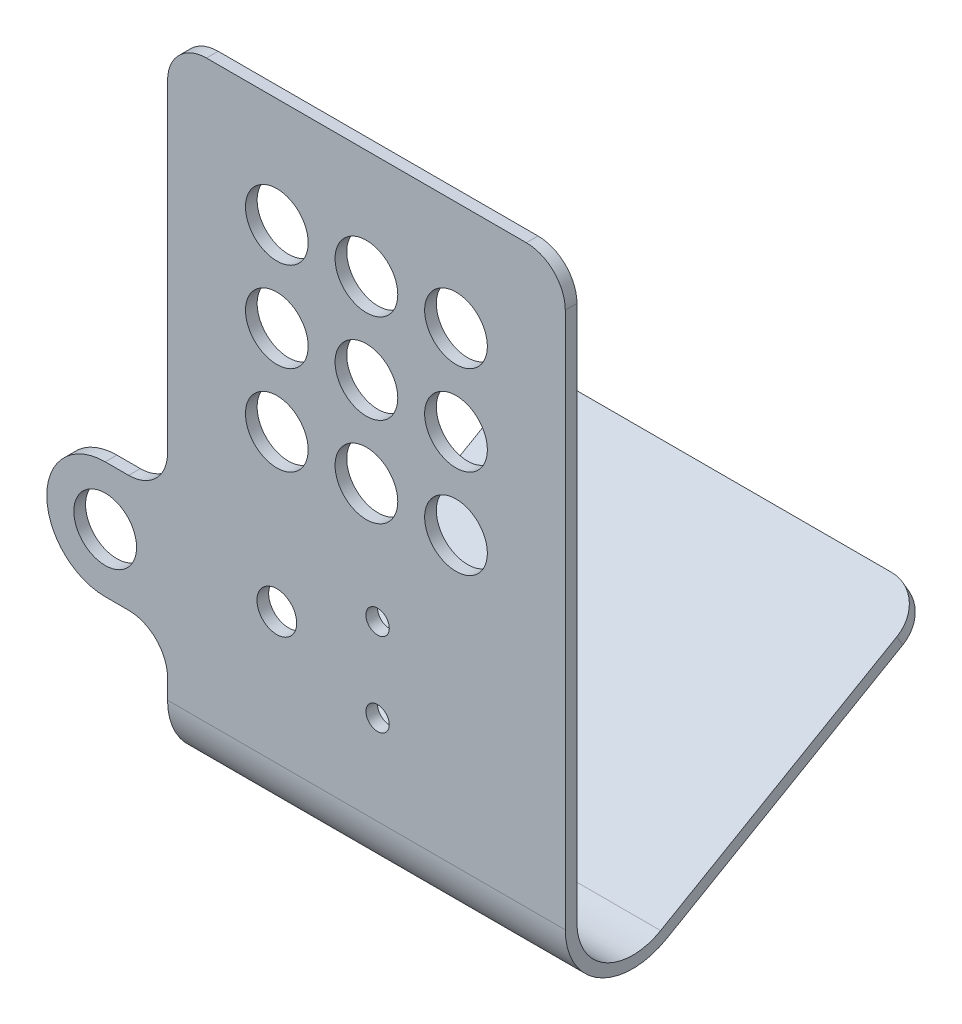
ISO-10303-21;
HEADER;
FILE_DESCRIPTION(('STEP AP214'),'2;1');
FILE_NAME('part.step','',(''),(''),'','','');
FILE_SCHEMA(('AUTOMOTIVE_DESIGN { 1 0 10303 214 1 1 1 1 }'));
ENDSEC;
DATA;
#1=APPLICATION_CONTEXT('core data for automotive mechanical design processes');
#2=APPLICATION_PROTOCOL_DEFINITION('international standard','automotive_design',2000,#1);
#3=PRODUCT_CONTEXT('',#1,'mechanical');
#4=PRODUCT('Part','Part','',(#3));
#5=PRODUCT_RELATED_PRODUCT_CATEGORY('part','',(#4));
#6=PRODUCT_DEFINITION_FORMATION('','',#4);
#7=PRODUCT_DEFINITION_CONTEXT('part definition',#1,'design');
#8=PRODUCT_DEFINITION('design','',#6,#7);
#9=PRODUCT_DEFINITION_SHAPE('','',#8);
#10=(LENGTH_UNIT() NAMED_UNIT(*) SI_UNIT(.MILLI.,.METRE.));
#11=(NAMED_UNIT(*) PLANE_ANGLE_UNIT() SI_UNIT($,.RADIAN.));
#12=(NAMED_UNIT(*) SI_UNIT($,.STERADIAN.) SOLID_ANGLE_UNIT());
#13=UNCERTAINTY_MEASURE_WITH_UNIT(LENGTH_MEASURE(1.E-05),#10,'distance_accuracy_value','');
#14=(GEOMETRIC_REPRESENTATION_CONTEXT(3) GLOBAL_UNCERTAINTY_ASSIGNED_CONTEXT((#13)) GLOBAL_UNIT_ASSIGNED_CONTEXT((#10,
#11,#12)) REPRESENTATION_CONTEXT('',''));
#15=CARTESIAN_POINT('',(0.,0.,0.));
#16=DIRECTION('',(0.,0.,1.));
#17=DIRECTION('',(1.,0.,0.));
#18=AXIS2_PLACEMENT_3D('',#15,#16,#17);
#19=CARTESIAN_POINT('',(-51.05,0.,-3.));
#20=DIRECTION('',(-1.,0.,0.));
#21=DIRECTION('',(0.,-1.,0.));
#22=AXIS2_PLACEMENT_3D('',#19,#20,#21);
#23=PLANE('',#22);
#24=DIRECTION('',(0.,-1.,0.));
#25=VECTOR('',#24,1.);
#26=CARTESIAN_POINT('',(-51.05,0.,0.));
#27=LINE('',#26,#25);
#28=CARTESIAN_POINT('',(-51.05,-91.7151361062223,0.));
#29=VERTEX_POINT('',#28);
#30=CARTESIAN_POINT('',(-51.05,-96.7151361062223,0.));
#31=VERTEX_POINT('',#30);
#32=EDGE_CURVE('E311',#29,#31,#27,.T.);
#33=ORIENTED_EDGE('',*,*,#32,.F.);
#34=DIRECTION('',(0.,0.,-1.));
#35=VECTOR('',#34,1.);
#36=CARTESIAN_POINT('',(-51.05,-91.7151361062223,-3.));
#37=LINE('',#36,#35);
#38=CARTESIAN_POINT('',(-51.05,-91.7151361062223,-3.));
#39=VERTEX_POINT('',#38);
#40=EDGE_CURVE('E353',#29,#39,#37,.T.);
#41=ORIENTED_EDGE('',*,*,#40,.T.);
#42=DIRECTION('',(0.,-1.,0.));
#43=VECTOR('',#42,1.);
#44=CARTESIAN_POINT('',(-51.05,0.,-3.));
#45=LINE('',#44,#43);
#46=CARTESIAN_POINT('',(-51.05,-96.7151361062223,-3.));
#47=VERTEX_POINT('',#46);
#48=EDGE_CURVE('E265',#39,#47,#45,.T.);
#49=ORIENTED_EDGE('',*,*,#48,.T.);
#50=CARTESIAN_POINT('',(-51.05,-96.7151361062223,-17.3205080756887));
#51=DIRECTION('',(1.,0.,0.));
#52=DIRECTION('',(0.,1.,0.));
#53=AXIS2_PLACEMENT_3D('',#50,#51,#52);
#54=CIRCLE('',#53,14.3205080756887);
#55=CARTESIAN_POINT('',(-51.05,-109.117059894869,-24.4807621135331));
#56=VERTEX_POINT('',#55);
#57=EDGE_CURVE('E202',#47,#56,#54,.T.);
#58=ORIENTED_EDGE('',*,*,#57,.T.);
#59=DIRECTION('',(0.,0.500000000000004,-0.866025403784436));
#60=VECTOR('',#59,1.);
#61=CARTESIAN_POINT('',(-51.05,-109.117059894869,-24.4807621135331));
#62=LINE('',#61,#60);
#63=CARTESIAN_POINT('',(-51.05,-74.1170598948686,-85.1025403784436));
#64=VERTEX_POINT('',#63);
#65=EDGE_CURVE('E205',#56,#64,#62,.T.);
#66=ORIENTED_EDGE('',*,*,#65,.T.);
#67=DIRECTION('',(0.,-0.866025403784435,-0.500000000000006));
#68=VECTOR('',#67,1.);
#69=CARTESIAN_POINT('',(-51.05,17.0221778677676,-32.4832769224475));
#70=LINE('',#69,#68);
#71=CARTESIAN_POINT('',(-51.05,-76.7151361062219,-86.6025403784436));
#72=VERTEX_POINT('',#71);
#73=EDGE_CURVE('E337',#64,#72,#70,.T.);
#74=ORIENTED_EDGE('',*,*,#73,.T.);
#75=DIRECTION('',(0.,-0.500000000000004,0.866025403784436));
#76=VECTOR('',#75,1.);
#77=CARTESIAN_POINT('',(-51.05,-71.7151361062219,-95.262794416288));
#78=LINE('',#77,#76);
#79=CARTESIAN_POINT('',(-51.05,-111.715136106222,-25.9807621135331));
#80=VERTEX_POINT('',#79);
#81=EDGE_CURVE('E208',#72,#80,#78,.T.);
#82=ORIENTED_EDGE('',*,*,#81,.T.);
#83=CARTESIAN_POINT('',(-51.05,-96.7151361062223,-17.3205080756887));
#84=DIRECTION('',(-1.,0.,0.));
#85=DIRECTION('',(0.,1.,0.));
#86=AXIS2_PLACEMENT_3D('',#83,#84,#85);
#87=CIRCLE('',#86,17.3205080756887);
#88=EDGE_CURVE('E210',#80,#31,#87,.T.);
#89=ORIENTED_EDGE('',*,*,#88,.T.);
#90=EDGE_LOOP('',(#33,#41,#49,#58,#66,#74,#82,#89));
#91=FACE_BOUND('',#90,.T.);
#92=ADVANCED_FACE('F34',(#91),#23,.T.);
#93=CARTESIAN_POINT('',(0.,51.05,-3.));
#94=DIRECTION('',(0.,1.,0.));
#95=DIRECTION('',(0.,0.,1.));
#96=AXIS2_PLACEMENT_3D('',#93,#94,#95);
#97=PLANE('',#96);
#98=DIRECTION('',(-1.,0.,0.));
#99=VECTOR('',#98,1.);
#100=CARTESIAN_POINT('',(0.,51.05,-3.));
#101=LINE('',#100,#99);
#102=CARTESIAN_POINT('',(41.05,51.05,-3.));
#103=VERTEX_POINT('',#102);
#104=CARTESIAN_POINT('',(-41.05,51.05,-3.));
#105=VERTEX_POINT('',#104);
#106=EDGE_CURVE('E262',#103,#105,#101,.T.);
#107=ORIENTED_EDGE('',*,*,#106,.T.);
#108=DIRECTION('',(0.,0.,1.));
#109=VECTOR('',#108,1.);
#110=CARTESIAN_POINT('',(-41.05,51.05,-3.));
#111=LINE('',#110,#109);
#112=CARTESIAN_POINT('',(-41.05,51.05,0.));
#113=VERTEX_POINT('',#112);
#114=EDGE_CURVE('E342',#105,#113,#111,.T.);
#115=ORIENTED_EDGE('',*,*,#114,.T.);
#116=DIRECTION('',(-1.,0.,0.));
#117=VECTOR('',#116,1.);
#118=CARTESIAN_POINT('',(0.,51.05,0.));
#119=LINE('',#118,#117);
#120=CARTESIAN_POINT('',(41.05,51.05,0.));
#121=VERTEX_POINT('',#120);
#122=EDGE_CURVE('E309',#121,#113,#119,.T.);
#123=ORIENTED_EDGE('',*,*,#122,.F.);
#124=DIRECTION('',(0.,0.,1.));
#125=VECTOR('',#124,1.);
#126=CARTESIAN_POINT('',(41.05,51.05,-3.));
#127=LINE('',#126,#125);
#128=EDGE_CURVE('E340',#121,#103,#127,.F.);
#129=ORIENTED_EDGE('',*,*,#128,.T.);
#130=EDGE_LOOP('',(#107,#115,#123,#129));
#131=FACE_BOUND('',#130,.T.);
#132=ADVANCED_FACE('F407',(#131),#97,.T.);
#133=CARTESIAN_POINT('',(51.05,0.,-3.));
#134=DIRECTION('',(-1.,0.,0.));
#135=DIRECTION('',(0.,-1.,0.));
#136=AXIS2_PLACEMENT_3D('',#133,#134,#135);
#137=PLANE('',#136);
#138=DIRECTION('',(0.,0.500000000000004,-0.866025403784436));
#139=VECTOR('',#138,1.);
#140=CARTESIAN_POINT('',(51.05,-71.7151361062219,-95.262794416288));
#141=LINE('',#140,#139);
#142=CARTESIAN_POINT('',(51.05,-111.715136106222,-25.9807621135331));
#143=VERTEX_POINT('',#142);
#144=CARTESIAN_POINT('',(51.05,-76.7151361062219,-86.6025403784436));
#145=VERTEX_POINT('',#144);
#146=EDGE_CURVE('E192',#143,#145,#141,.T.);
#147=ORIENTED_EDGE('',*,*,#146,.T.);
#148=DIRECTION('',(0.,0.866025403784435,0.500000000000006));
#149=VECTOR('',#148,1.);
#150=CARTESIAN_POINT('',(51.05,-74.1170598948687,-85.1025403784436));
#151=LINE('',#150,#149);
#152=CARTESIAN_POINT('',(51.05,-74.1170598948686,-85.1025403784436));
#153=VERTEX_POINT('',#152);
#154=EDGE_CURVE('E320',#145,#153,#151,.T.);
#155=ORIENTED_EDGE('',*,*,#154,.T.);
#156=DIRECTION('',(0.,-0.500000000000004,0.866025403784436));
#157=VECTOR('',#156,1.);
#158=CARTESIAN_POINT('',(51.05,-109.117059894869,-24.4807621135331));
#159=LINE('',#158,#157);
#160=CARTESIAN_POINT('',(51.05,-109.117059894869,-24.4807621135331));
#161=VERTEX_POINT('',#160);
#162=EDGE_CURVE('E201',#153,#161,#159,.T.);
#163=ORIENTED_EDGE('',*,*,#162,.T.);
#164=CARTESIAN_POINT('',(51.05,-96.7151361062223,-17.3205080756887));
#165=DIRECTION('',(-1.,0.,0.));
#166=DIRECTION('',(0.,-1.,0.));
#167=AXIS2_PLACEMENT_3D('',#164,#165,#166);
#168=CIRCLE('',#167,14.3205080756887);
#169=CARTESIAN_POINT('',(51.05,-96.7151361062223,-3.));
#170=VERTEX_POINT('',#169);
#171=EDGE_CURVE('E198',#161,#170,#168,.T.);
#172=ORIENTED_EDGE('',*,*,#171,.T.);
#173=DIRECTION('',(0.,-1.,0.));
#174=VECTOR('',#173,1.);
#175=CARTESIAN_POINT('',(51.05,0.,-3.));
#176=LINE('',#175,#174);
#177=CARTESIAN_POINT('',(51.05,41.05,-3.));
#178=VERTEX_POINT('',#177);
#179=EDGE_CURVE('E271',#178,#170,#176,.T.);
#180=ORIENTED_EDGE('',*,*,#179,.F.);
#181=DIRECTION('',(0.,0.,1.));
#182=VECTOR('',#181,1.);
#183=CARTESIAN_POINT('',(51.05,41.05,0.));
#184=LINE('',#183,#182);
#185=CARTESIAN_POINT('',(51.05,41.05,0.));
#186=VERTEX_POINT('',#185);
#187=EDGE_CURVE('E273',#178,#186,#184,.T.);
#188=ORIENTED_EDGE('',*,*,#187,.T.);
#189=DIRECTION('',(0.,-1.,0.));
#190=VECTOR('',#189,1.);
#191=CARTESIAN_POINT('',(51.05,0.,0.));
#192=LINE('',#191,#190);
#193=CARTESIAN_POINT('',(51.05,-96.7151361062223,0.));
#194=VERTEX_POINT('',#193);
#195=EDGE_CURVE('E229',#186,#194,#192,.T.);
#196=ORIENTED_EDGE('',*,*,#195,.T.);
#197=CARTESIAN_POINT('',(51.05,-96.7151361062223,-17.3205080756887));
#198=DIRECTION('',(-1.,0.,0.));
#199=DIRECTION('',(0.,-1.,0.));
#200=AXIS2_PLACEMENT_3D('',#197,#198,#199);
#201=CIRCLE('',#200,17.3205080756887);
#202=EDGE_CURVE('E195',#194,#143,#201,.F.);
#203=ORIENTED_EDGE('',*,*,#202,.T.);
#204=EDGE_LOOP('',(#147,#155,#163,#172,#180,#188,#196,#203));
#205=FACE_BOUND('',#204,.T.);
#206=ADVANCED_FACE('F411',(#205),#137,.F.);
#207=CARTESIAN_POINT('',(-23.,23.,-3.));
#208=DIRECTION('',(0.,0.,1.));
#209=DIRECTION('',(1.,0.,0.));
#210=AXIS2_PLACEMENT_3D('',#207,#208,#209);
#211=CYLINDRICAL_SURFACE('',#210,8.05000000000001);
#212=CARTESIAN_POINT('',(-23.,23.,-3.));
#213=DIRECTION('',(0.,0.,1.));
#214=DIRECTION('',(1.,0.,0.));
#215=AXIS2_PLACEMENT_3D('',#212,#213,#214);
#216=CIRCLE('',#215,8.05000000000001);
#217=CARTESIAN_POINT('',(-14.95,23.,-3.));
#218=VERTEX_POINT('',#217);
#219=EDGE_CURVE('E259',#218,#218,#216,.T.);
#220=ORIENTED_EDGE('',*,*,#219,.F.);
#221=EDGE_LOOP('',(#220));
#222=FACE_BOUND('',#221,.T.);
#223=CARTESIAN_POINT('',(-23.,23.,0.));
#224=DIRECTION('',(0.,0.,1.));
#225=DIRECTION('',(1.,0.,0.));
#226=AXIS2_PLACEMENT_3D('',#223,#224,#225);
#227=CIRCLE('',#226,8.05000000000001);
#228=CARTESIAN_POINT('',(-14.95,23.,0.));
#229=VERTEX_POINT('',#228);
#230=EDGE_CURVE('E306',#229,#229,#227,.T.);
#231=ORIENTED_EDGE('',*,*,#230,.T.);
#232=EDGE_LOOP('',(#231));
#233=FACE_BOUND('',#232,.T.);
#234=ADVANCED_FACE('F416',(#222,#233),#211,.F.);
#235=CARTESIAN_POINT('',(0.,23.,-3.));
#236=DIRECTION('',(0.,0.,1.));
#237=DIRECTION('',(1.,0.,0.));
#238=AXIS2_PLACEMENT_3D('',#235,#236,#237);
#239=CYLINDRICAL_SURFACE('',#238,8.05);
#240=CARTESIAN_POINT('',(0.,23.,-3.));
#241=DIRECTION('',(0.,0.,1.));
#242=DIRECTION('',(1.,0.,0.));
#243=AXIS2_PLACEMENT_3D('',#240,#241,#242);
#244=CIRCLE('',#243,8.05);
#245=CARTESIAN_POINT('',(8.05,23.,-3.));
#246=VERTEX_POINT('',#245);
#247=EDGE_CURVE('E256',#246,#246,#244,.T.);
#248=ORIENTED_EDGE('',*,*,#247,.F.);
#249=EDGE_LOOP('',(#248));
#250=FACE_BOUND('',#249,.T.);
#251=CARTESIAN_POINT('',(0.,23.,0.));
#252=DIRECTION('',(0.,0.,1.));
#253=DIRECTION('',(1.,0.,0.));
#254=AXIS2_PLACEMENT_3D('',#251,#252,#253);
#255=CIRCLE('',#254,8.05);
#256=CARTESIAN_POINT('',(8.05,23.,0.));
#257=VERTEX_POINT('',#256);
#258=EDGE_CURVE('E303',#257,#257,#255,.T.);
#259=ORIENTED_EDGE('',*,*,#258,.T.);
#260=EDGE_LOOP('',(#259));
#261=FACE_BOUND('',#260,.T.);
#262=ADVANCED_FACE('F419',(#250,#261),#239,.F.);
#263=CARTESIAN_POINT('',(2.86862691031601,-52.2848638937774,-3.));
#264=DIRECTION('',(0.,0.,1.));
#265=DIRECTION('',(1.,0.,0.));
#266=AXIS2_PLACEMENT_3D('',#263,#264,#265);
#267=CYLINDRICAL_SURFACE('',#266,3.);
#268=CARTESIAN_POINT('',(2.86862691031601,-52.2848638937774,-3.));
#269=DIRECTION('',(0.,0.,1.));
#270=DIRECTION('',(1.,0.,0.));
#271=AXIS2_PLACEMENT_3D('',#268,#269,#270);
#272=CIRCLE('',#271,3.);
#273=CARTESIAN_POINT('',(5.86862691031601,-52.2848638937774,-3.));
#274=VERTEX_POINT('',#273);
#275=EDGE_CURVE('E253',#274,#274,#272,.T.);
#276=ORIENTED_EDGE('',*,*,#275,.F.);
#277=EDGE_LOOP('',(#276));
#278=FACE_BOUND('',#277,.T.);
#279=CARTESIAN_POINT('',(2.86862691031601,-52.2848638937774,0.));
#280=DIRECTION('',(0.,0.,1.));
#281=DIRECTION('',(1.,0.,0.));
#282=AXIS2_PLACEMENT_3D('',#279,#280,#281);
#283=CIRCLE('',#282,3.);
#284=CARTESIAN_POINT('',(5.86862691031601,-52.2848638937774,0.));
#285=VERTEX_POINT('',#284);
#286=EDGE_CURVE('E300',#285,#285,#283,.T.);
#287=ORIENTED_EDGE('',*,*,#286,.T.);
#288=EDGE_LOOP('',(#287));
#289=FACE_BOUND('',#288,.T.);
#290=ADVANCED_FACE('F423',(#278,#289),#267,.F.);
#291=CARTESIAN_POINT('',(23.,0.,-3.));
#292=DIRECTION('',(0.,0.,1.));
#293=DIRECTION('',(1.,0.,0.));
#294=AXIS2_PLACEMENT_3D('',#291,#292,#293);
#295=CYLINDRICAL_SURFACE('',#294,8.05000000000001);
#296=CARTESIAN_POINT('',(23.,0.,-3.));
#297=DIRECTION('',(0.,0.,1.));
#298=DIRECTION('',(1.,0.,0.));
#299=AXIS2_PLACEMENT_3D('',#296,#297,#298);
#300=CIRCLE('',#299,8.05000000000001);
#301=CARTESIAN_POINT('',(31.05,0.,-3.));
#302=VERTEX_POINT('',#301);
#303=EDGE_CURVE('E250',#302,#302,#300,.T.);
#304=ORIENTED_EDGE('',*,*,#303,.F.);
#305=EDGE_LOOP('',(#304));
#306=FACE_BOUND('',#305,.T.);
#307=CARTESIAN_POINT('',(23.,0.,0.));
#308=DIRECTION('',(0.,0.,1.));
#309=DIRECTION('',(1.,0.,0.));
#310=AXIS2_PLACEMENT_3D('',#307,#308,#309);
#311=CIRCLE('',#310,8.05000000000001);
#312=CARTESIAN_POINT('',(31.05,0.,0.));
#313=VERTEX_POINT('',#312);
#314=EDGE_CURVE('E297',#313,#313,#311,.T.);
#315=ORIENTED_EDGE('',*,*,#314,.T.);
#316=EDGE_LOOP('',(#315));
#317=FACE_BOUND('',#316,.T.);
#318=ADVANCED_FACE('F427',(#306,#317),#295,.F.);
#319=CARTESIAN_POINT('',(23.,-23.,-3.));
#320=DIRECTION('',(0.,0.,1.));
#321=DIRECTION('',(1.,0.,0.));
#322=AXIS2_PLACEMENT_3D('',#319,#320,#321);
#323=CYLINDRICAL_SURFACE('',#322,8.05000000000001);
#324=CARTESIAN_POINT('',(23.,-23.,-3.));
#325=DIRECTION('',(0.,0.,1.));
#326=DIRECTION('',(1.,0.,0.));
#327=AXIS2_PLACEMENT_3D('',#324,#325,#326);
#328=CIRCLE('',#327,8.05000000000001);
#329=CARTESIAN_POINT('',(31.05,-23.,-3.));
#330=VERTEX_POINT('',#329);
#331=EDGE_CURVE('E247',#330,#330,#328,.T.);
#332=ORIENTED_EDGE('',*,*,#331,.F.);
#333=EDGE_LOOP('',(#332));
#334=FACE_BOUND('',#333,.T.);
#335=CARTESIAN_POINT('',(23.,-23.,0.));
#336=DIRECTION('',(0.,0.,1.));
#337=DIRECTION('',(1.,0.,0.));
#338=AXIS2_PLACEMENT_3D('',#335,#336,#337);
#339=CIRCLE('',#338,8.05000000000001);
#340=CARTESIAN_POINT('',(31.05,-23.,0.));
#341=VERTEX_POINT('',#340);
#342=EDGE_CURVE('E294',#341,#341,#339,.T.);
#343=ORIENTED_EDGE('',*,*,#342,.T.);
#344=EDGE_LOOP('',(#343));
#345=FACE_BOUND('',#344,.T.);
#346=ADVANCED_FACE('F431',(#334,#345),#323,.F.);
#347=CARTESIAN_POINT('',(-23.,0.,-3.));
#348=DIRECTION('',(0.,0.,1.));
#349=DIRECTION('',(1.,0.,0.));
#350=AXIS2_PLACEMENT_3D('',#347,#348,#349);
#351=CYLINDRICAL_SURFACE('',#350,8.05);
#352=CARTESIAN_POINT('',(-23.,0.,-3.));
#353=DIRECTION('',(0.,0.,1.));
#354=DIRECTION('',(1.,0.,0.));
#355=AXIS2_PLACEMENT_3D('',#352,#353,#354);
#356=CIRCLE('',#355,8.05);
#357=CARTESIAN_POINT('',(-14.95,0.,-3.));
#358=VERTEX_POINT('',#357);
#359=EDGE_CURVE('E244',#358,#358,#356,.T.);
#360=ORIENTED_EDGE('',*,*,#359,.F.);
#361=EDGE_LOOP('',(#360));
#362=FACE_BOUND('',#361,.T.);
#363=CARTESIAN_POINT('',(-23.,0.,0.));
#364=DIRECTION('',(0.,0.,1.));
#365=DIRECTION('',(1.,0.,0.));
#366=AXIS2_PLACEMENT_3D('',#363,#364,#365);
#367=CIRCLE('',#366,8.05);
#368=CARTESIAN_POINT('',(-14.95,0.,0.));
#369=VERTEX_POINT('',#368);
#370=EDGE_CURVE('E291',#369,#369,#367,.T.);
#371=ORIENTED_EDGE('',*,*,#370,.T.);
#372=EDGE_LOOP('',(#371));
#373=FACE_BOUND('',#372,.T.);
#374=ADVANCED_FACE('F435',(#362,#373),#351,.F.);
#375=CARTESIAN_POINT('',(0.,0.,-3.));
#376=DIRECTION('',(0.,0.,1.));
#377=DIRECTION('',(1.,0.,0.));
#378=AXIS2_PLACEMENT_3D('',#375,#376,#377);
#379=CYLINDRICAL_SURFACE('',#378,8.05);
#380=CARTESIAN_POINT('',(0.,0.,-3.));
#381=DIRECTION('',(0.,0.,1.));
#382=DIRECTION('',(1.,0.,0.));
#383=AXIS2_PLACEMENT_3D('',#380,#381,#382);
#384=CIRCLE('',#383,8.05);
#385=CARTESIAN_POINT('',(8.05,0.,-3.));
#386=VERTEX_POINT('',#385);
#387=EDGE_CURVE('E241',#386,#386,#384,.T.);
#388=ORIENTED_EDGE('',*,*,#387,.F.);
#389=EDGE_LOOP('',(#388));
#390=FACE_BOUND('',#389,.T.);
#391=CARTESIAN_POINT('',(0.,0.,0.));
#392=DIRECTION('',(0.,0.,1.));
#393=DIRECTION('',(1.,0.,0.));
#394=AXIS2_PLACEMENT_3D('',#391,#392,#393);
#395=CIRCLE('',#394,8.05);
#396=CARTESIAN_POINT('',(8.05,0.,0.));
#397=VERTEX_POINT('',#396);
#398=EDGE_CURVE('E288',#397,#397,#395,.T.);
#399=ORIENTED_EDGE('',*,*,#398,.T.);
#400=EDGE_LOOP('',(#399));
#401=FACE_BOUND('',#400,.T.);
#402=ADVANCED_FACE('F439',(#390,#401),#379,.F.);
#403=CARTESIAN_POINT('',(-23.,-23.,-3.));
#404=DIRECTION('',(0.,0.,1.));
#405=DIRECTION('',(1.,0.,0.));
#406=AXIS2_PLACEMENT_3D('',#403,#404,#405);
#407=CYLINDRICAL_SURFACE('',#406,8.05);
#408=CARTESIAN_POINT('',(-23.,-23.,-3.));
#409=DIRECTION('',(0.,0.,1.));
#410=DIRECTION('',(1.,0.,0.));
#411=AXIS2_PLACEMENT_3D('',#408,#409,#410);
#412=CIRCLE('',#411,8.05);
#413=CARTESIAN_POINT('',(-14.95,-23.,-3.));
#414=VERTEX_POINT('',#413);
#415=EDGE_CURVE('E238',#414,#414,#412,.T.);
#416=ORIENTED_EDGE('',*,*,#415,.F.);
#417=EDGE_LOOP('',(#416));
#418=FACE_BOUND('',#417,.T.);
#419=CARTESIAN_POINT('',(-23.,-23.,0.));
#420=DIRECTION('',(0.,0.,1.));
#421=DIRECTION('',(1.,0.,0.));
#422=AXIS2_PLACEMENT_3D('',#419,#420,#421);
#423=CIRCLE('',#422,8.05);
#424=CARTESIAN_POINT('',(-14.95,-23.,0.));
#425=VERTEX_POINT('',#424);
#426=EDGE_CURVE('E285',#425,#425,#423,.T.);
#427=ORIENTED_EDGE('',*,*,#426,.T.);
#428=EDGE_LOOP('',(#427));
#429=FACE_BOUND('',#428,.T.);
#430=ADVANCED_FACE('F443',(#418,#429),#407,.F.);
#431=CARTESIAN_POINT('',(0.,-23.,-3.));
#432=DIRECTION('',(0.,0.,1.));
#433=DIRECTION('',(1.,0.,0.));
#434=AXIS2_PLACEMENT_3D('',#431,#432,#433);
#435=CYLINDRICAL_SURFACE('',#434,8.05000000000001);
#436=CARTESIAN_POINT('',(0.,-23.,-3.));
#437=DIRECTION('',(0.,0.,1.));
#438=DIRECTION('',(1.,0.,0.));
#439=AXIS2_PLACEMENT_3D('',#436,#437,#438);
#440=CIRCLE('',#439,8.05000000000001);
#441=CARTESIAN_POINT('',(8.05000000000001,-23.,-3.));
#442=VERTEX_POINT('',#441);
#443=EDGE_CURVE('E235',#442,#442,#440,.T.);
#444=ORIENTED_EDGE('',*,*,#443,.F.);
#445=EDGE_LOOP('',(#444));
#446=FACE_BOUND('',#445,.T.);
#447=CARTESIAN_POINT('',(0.,-23.,0.));
#448=DIRECTION('',(0.,0.,1.));
#449=DIRECTION('',(1.,0.,0.));
#450=AXIS2_PLACEMENT_3D('',#447,#448,#449);
#451=CIRCLE('',#450,8.05000000000001);
#452=CARTESIAN_POINT('',(8.05000000000001,-23.,0.));
#453=VERTEX_POINT('',#452);
#454=EDGE_CURVE('E282',#453,#453,#451,.T.);
#455=ORIENTED_EDGE('',*,*,#454,.T.);
#456=EDGE_LOOP('',(#455));
#457=FACE_BOUND('',#456,.T.);
#458=ADVANCED_FACE('F447',(#446,#457),#435,.F.);
#459=CARTESIAN_POINT('',(23.,23.,-3.));
#460=DIRECTION('',(0.,0.,1.));
#461=DIRECTION('',(1.,0.,0.));
#462=AXIS2_PLACEMENT_3D('',#459,#460,#461);
#463=CYLINDRICAL_SURFACE('',#462,8.05);
#464=CARTESIAN_POINT('',(23.,23.,-3.));
#465=DIRECTION('',(0.,0.,1.));
#466=DIRECTION('',(1.,0.,0.));
#467=AXIS2_PLACEMENT_3D('',#464,#465,#466);
#468=CIRCLE('',#467,8.05);
#469=CARTESIAN_POINT('',(31.05,23.,-3.));
#470=VERTEX_POINT('',#469);
#471=EDGE_CURVE('E232',#470,#470,#468,.T.);
#472=ORIENTED_EDGE('',*,*,#471,.F.);
#473=EDGE_LOOP('',(#472));
#474=FACE_BOUND('',#473,.T.);
#475=CARTESIAN_POINT('',(23.,23.,0.));
#476=DIRECTION('',(0.,0.,1.));
#477=DIRECTION('',(1.,0.,0.));
#478=AXIS2_PLACEMENT_3D('',#475,#476,#477);
#479=CIRCLE('',#478,8.05);
#480=CARTESIAN_POINT('',(31.05,23.,0.));
#481=VERTEX_POINT('',#480);
#482=EDGE_CURVE('E279',#481,#481,#479,.T.);
#483=ORIENTED_EDGE('',*,*,#482,.T.);
#484=EDGE_LOOP('',(#483));
#485=FACE_BOUND('',#484,.T.);
#486=ADVANCED_FACE('F451',(#474,#485),#463,.F.);
#487=CARTESIAN_POINT('',(-23.,-63.,-3.));
#488=DIRECTION('',(0.,0.,1.));
#489=DIRECTION('',(1.,0.,0.));
#490=AXIS2_PLACEMENT_3D('',#487,#488,#489);
#491=CYLINDRICAL_SURFACE('',#490,5.10000000000213);
#492=CARTESIAN_POINT('',(-23.,-63.,-3.));
#493=DIRECTION('',(0.,0.,1.));
#494=DIRECTION('',(1.,0.,0.));
#495=AXIS2_PLACEMENT_3D('',#492,#493,#494);
#496=CIRCLE('',#495,5.10000000000213);
#497=CARTESIAN_POINT('',(-17.8999999999979,-63.,-3.));
#498=VERTEX_POINT('',#497);
#499=EDGE_CURVE('E228',#498,#498,#496,.T.);
#500=ORIENTED_EDGE('',*,*,#499,.F.);
#501=EDGE_LOOP('',(#500));
#502=FACE_BOUND('',#501,.T.);
#503=CARTESIAN_POINT('',(-23.,-63.,0.));
#504=DIRECTION('',(0.,0.,1.));
#505=DIRECTION('',(1.,0.,0.));
#506=AXIS2_PLACEMENT_3D('',#503,#504,#505);
#507=CIRCLE('',#506,5.10000000000213);
#508=CARTESIAN_POINT('',(-17.8999999999979,-63.,0.));
#509=VERTEX_POINT('',#508);
#510=EDGE_CURVE('E276',#509,#509,#507,.T.);
#511=ORIENTED_EDGE('',*,*,#510,.T.);
#512=EDGE_LOOP('',(#511));
#513=FACE_BOUND('',#512,.T.);
#514=ADVANCED_FACE('F455',(#502,#513),#491,.F.);
#515=CARTESIAN_POINT('',(2.8686269103161,-73.7151361062223,-3.));
#516=DIRECTION('',(0.,0.,1.));
#517=DIRECTION('',(1.,0.,0.));
#518=AXIS2_PLACEMENT_3D('',#515,#516,#517);
#519=CYLINDRICAL_SURFACE('',#518,3.00000000000001);
#520=CARTESIAN_POINT('',(2.8686269103161,-73.7151361062223,-3.));
#521=DIRECTION('',(0.,0.,1.));
#522=DIRECTION('',(1.,0.,0.));
#523=AXIS2_PLACEMENT_3D('',#520,#521,#522);
#524=CIRCLE('',#523,3.00000000000001);
#525=CARTESIAN_POINT('',(5.86862691031611,-73.7151361062223,-3.));
#526=VERTEX_POINT('',#525);
#527=EDGE_CURVE('E225',#526,#526,#524,.T.);
#528=ORIENTED_EDGE('',*,*,#527,.F.);
#529=EDGE_LOOP('',(#528));
#530=FACE_BOUND('',#529,.T.);
#531=CARTESIAN_POINT('',(2.8686269103161,-73.7151361062223,0.));
#532=DIRECTION('',(0.,0.,1.));
#533=DIRECTION('',(1.,0.,0.));
#534=AXIS2_PLACEMENT_3D('',#531,#532,#533);
#535=CIRCLE('',#534,3.00000000000001);
#536=CARTESIAN_POINT('',(5.86862691031611,-73.7151361062223,0.));
#537=VERTEX_POINT('',#536);
#538=EDGE_CURVE('E224',#537,#537,#535,.T.);
#539=ORIENTED_EDGE('',*,*,#538,.T.);
#540=EDGE_LOOP('',(#539));
#541=FACE_BOUND('',#540,.T.);
#542=ADVANCED_FACE('F402',(#530,#541),#519,.F.);
#543=CARTESIAN_POINT('',(-51.05,41.05,-3.));
#544=VERTEX_POINT('',#543);
#545=CARTESIAN_POINT('',(-51.05,-41.7151361062223,-3.));
#546=VERTEX_POINT('',#545);
#547=EDGE_CURVE('E266',#544,#546,#45,.T.);
#548=ORIENTED_EDGE('',*,*,#547,.T.);
#549=DIRECTION('',(0.,0.,-1.));
#550=VECTOR('',#549,1.);
#551=CARTESIAN_POINT('',(-51.05,-41.7151361062223,0.));
#552=LINE('',#551,#550);
#553=CARTESIAN_POINT('',(-51.05,-41.7151361062223,0.));
#554=VERTEX_POINT('',#553);
#555=EDGE_CURVE('E55',#546,#554,#552,.F.);
#556=ORIENTED_EDGE('',*,*,#555,.T.);
#557=CARTESIAN_POINT('',(-51.05,41.05,0.));
#558=VERTEX_POINT('',#557);
#559=EDGE_CURVE('E312',#558,#554,#27,.T.);
#560=ORIENTED_EDGE('',*,*,#559,.F.);
#561=DIRECTION('',(0.,0.,1.));
#562=VECTOR('',#561,1.);
#563=CARTESIAN_POINT('',(-51.05,41.05,-3.));
#564=LINE('',#563,#562);
#565=EDGE_CURVE('E335',#558,#544,#564,.F.);
#566=ORIENTED_EDGE('',*,*,#565,.T.);
#567=EDGE_LOOP('',(#548,#556,#560,#566));
#568=FACE_BOUND('',#567,.T.);
#569=ADVANCED_FACE('F392',(#568),#23,.T.);
#570=CARTESIAN_POINT('',(0.,0.,-3.));
#571=DIRECTION('',(0.,0.,1.));
#572=DIRECTION('',(1.,0.,0.));
#573=AXIS2_PLACEMENT_3D('',#570,#571,#572);
#574=PLANE('',#573);
#575=ORIENTED_EDGE('',*,*,#527,.T.);
#576=EDGE_LOOP('',(#575));
#577=FACE_BOUND('',#576,.T.);
#578=ORIENTED_EDGE('',*,*,#499,.T.);
#579=EDGE_LOOP('',(#578));
#580=FACE_BOUND('',#579,.T.);
#581=ORIENTED_EDGE('',*,*,#471,.T.);
#582=EDGE_LOOP('',(#581));
#583=FACE_BOUND('',#582,.T.);
#584=ORIENTED_EDGE('',*,*,#443,.T.);
#585=EDGE_LOOP('',(#584));
#586=FACE_BOUND('',#585,.T.);
#587=ORIENTED_EDGE('',*,*,#415,.T.);
#588=EDGE_LOOP('',(#587));
#589=FACE_BOUND('',#588,.T.);
#590=ORIENTED_EDGE('',*,*,#387,.T.);
#591=EDGE_LOOP('',(#590));
#592=FACE_BOUND('',#591,.T.);
#593=ORIENTED_EDGE('',*,*,#359,.T.);
#594=EDGE_LOOP('',(#593));
#595=FACE_BOUND('',#594,.T.);
#596=ORIENTED_EDGE('',*,*,#331,.T.);
#597=EDGE_LOOP('',(#596));
#598=FACE_BOUND('',#597,.T.);
#599=ORIENTED_EDGE('',*,*,#303,.T.);
#600=EDGE_LOOP('',(#599));
#601=FACE_BOUND('',#600,.T.);
#602=ORIENTED_EDGE('',*,*,#275,.T.);
#603=EDGE_LOOP('',(#602));
#604=FACE_BOUND('',#603,.T.);
#605=ORIENTED_EDGE('',*,*,#247,.T.);
#606=EDGE_LOOP('',(#605));
#607=FACE_BOUND('',#606,.T.);
#608=ORIENTED_EDGE('',*,*,#219,.T.);
#609=EDGE_LOOP('',(#608));
#610=FACE_BOUND('',#609,.T.);
#611=ORIENTED_EDGE('',*,*,#547,.F.);
#612=CARTESIAN_POINT('',(-41.05,41.05,-3.));
#613=DIRECTION('',(0.,0.,1.));
#614=DIRECTION('',(1.,0.,0.));
#615=AXIS2_PLACEMENT_3D('',#612,#613,#614);
#616=CIRCLE('',#615,10.);
#617=EDGE_CURVE('E351',#544,#105,#616,.F.);
#618=ORIENTED_EDGE('',*,*,#617,.T.);
#619=ORIENTED_EDGE('',*,*,#106,.F.);
#620=CARTESIAN_POINT('',(41.05,41.05,-3.));
#621=DIRECTION('',(0.,0.,1.));
#622=DIRECTION('',(1.,0.,0.));
#623=AXIS2_PLACEMENT_3D('',#620,#621,#622);
#624=CIRCLE('',#623,10.);
#625=EDGE_CURVE('E349',#103,#178,#624,.F.);
#626=ORIENTED_EDGE('',*,*,#625,.T.);
#627=ORIENTED_EDGE('',*,*,#179,.T.);
#628=DIRECTION('',(-1.,0.,0.));
#629=VECTOR('',#628,1.);
#630=CARTESIAN_POINT('',(0.,-96.7151361062223,-3.));
#631=LINE('',#630,#629);
#632=EDGE_CURVE('E268',#170,#47,#631,.T.);
#633=ORIENTED_EDGE('',*,*,#632,.T.);
#634=ORIENTED_EDGE('',*,*,#48,.F.);
#635=CARTESIAN_POINT('',(-61.05,-91.7151361062223,-3.));
#636=DIRECTION('',(0.,0.,1.));
#637=DIRECTION('',(1.,0.,0.));
#638=AXIS2_PLACEMENT_3D('',#635,#636,#637);
#639=CIRCLE('',#638,10.);
#640=CARTESIAN_POINT('',(-61.05,-81.7151361062223,-3.));
#641=VERTEX_POINT('',#640);
#642=EDGE_CURVE('E361',#39,#641,#639,.T.);
#643=ORIENTED_EDGE('',*,*,#642,.T.);
#644=DIRECTION('',(1.,0.,0.));
#645=VECTOR('',#644,1.);
#646=CARTESIAN_POINT('',(0.,-81.7151361062223,-3.));
#647=LINE('',#646,#645);
#648=CARTESIAN_POINT('',(-67.05,-81.7151361062223,-3.));
#649=VERTEX_POINT('',#648);
#650=EDGE_CURVE('E186',#649,#641,#647,.T.);
#651=ORIENTED_EDGE('',*,*,#650,.F.);
#652=CARTESIAN_POINT('',(-67.05,-66.7151361062223,-3.));
#653=DIRECTION('',(0.,0.,-1.));
#654=DIRECTION('',(-1.,0.,0.));
#655=AXIS2_PLACEMENT_3D('',#652,#653,#654);
#656=CIRCLE('',#655,15.);
#657=CARTESIAN_POINT('',(-67.05,-51.7151361062223,-3.));
#658=VERTEX_POINT('',#657);
#659=EDGE_CURVE('E385',#658,#649,#656,.F.);
#660=ORIENTED_EDGE('',*,*,#659,.F.);
#661=DIRECTION('',(1.,0.,0.));
#662=VECTOR('',#661,1.);
#663=CARTESIAN_POINT('',(0.,-51.7151361062223,-3.));
#664=LINE('',#663,#662);
#665=CARTESIAN_POINT('',(-61.05,-51.7151361062223,-3.));
#666=VERTEX_POINT('',#665);
#667=EDGE_CURVE('E185',#658,#666,#664,.T.);
#668=ORIENTED_EDGE('',*,*,#667,.T.);
#669=CARTESIAN_POINT('',(-61.05,-41.7151361062223,-3.));
#670=DIRECTION('',(0.,0.,1.));
#671=DIRECTION('',(1.,0.,0.));
#672=AXIS2_PLACEMENT_3D('',#669,#670,#671);
#673=CIRCLE('',#672,10.);
#674=EDGE_CURVE('E42',#666,#546,#673,.T.);
#675=ORIENTED_EDGE('',*,*,#674,.T.);
#676=EDGE_LOOP('',(#611,#618,#619,#626,#627,#633,#634,#643,#651,#660,#668,#675));
#677=FACE_BOUND('',#676,.T.);
#678=CARTESIAN_POINT('',(-67.05,-66.7151361062223,-3.));
#679=DIRECTION('',(0.,0.,-1.));
#680=DIRECTION('',(-1.,0.,0.));
#681=AXIS2_PLACEMENT_3D('',#678,#679,#680);
#682=CIRCLE('',#681,8.05000000000001);
#683=CARTESIAN_POINT('',(-75.1,-66.7151361062223,-3.));
#684=VERTEX_POINT('',#683);
#685=EDGE_CURVE('E180',#684,#684,#682,.T.);
#686=ORIENTED_EDGE('',*,*,#685,.F.);
#687=EDGE_LOOP('',(#686));
#688=FACE_BOUND('',#687,.T.);
#689=ADVANCED_FACE('F375',(#577,#580,#583,#586,#589,#592,#595,#598,#601,#604,#607,#610,#677,
#688),#574,.F.);
#690=CARTESIAN_POINT('',(0.,0.,0.));
#691=DIRECTION('',(0.,0.,1.));
#692=DIRECTION('',(1.,0.,0.));
#693=AXIS2_PLACEMENT_3D('',#690,#691,#692);
#694=PLANE('',#693);
#695=ORIENTED_EDGE('',*,*,#538,.F.);
#696=EDGE_LOOP('',(#695));
#697=FACE_BOUND('',#696,.T.);
#698=ORIENTED_EDGE('',*,*,#510,.F.);
#699=EDGE_LOOP('',(#698));
#700=FACE_BOUND('',#699,.T.);
#701=ORIENTED_EDGE('',*,*,#482,.F.);
#702=EDGE_LOOP('',(#701));
#703=FACE_BOUND('',#702,.T.);
#704=ORIENTED_EDGE('',*,*,#454,.F.);
#705=EDGE_LOOP('',(#704));
#706=FACE_BOUND('',#705,.T.);
#707=ORIENTED_EDGE('',*,*,#426,.F.);
#708=EDGE_LOOP('',(#707));
#709=FACE_BOUND('',#708,.T.);
#710=ORIENTED_EDGE('',*,*,#398,.F.);
#711=EDGE_LOOP('',(#710));
#712=FACE_BOUND('',#711,.T.);
#713=ORIENTED_EDGE('',*,*,#370,.F.);
#714=EDGE_LOOP('',(#713));
#715=FACE_BOUND('',#714,.T.);
#716=ORIENTED_EDGE('',*,*,#342,.F.);
#717=EDGE_LOOP('',(#716));
#718=FACE_BOUND('',#717,.T.);
#719=ORIENTED_EDGE('',*,*,#314,.F.);
#720=EDGE_LOOP('',(#719));
#721=FACE_BOUND('',#720,.T.);
#722=ORIENTED_EDGE('',*,*,#286,.F.);
#723=EDGE_LOOP('',(#722));
#724=FACE_BOUND('',#723,.T.);
#725=ORIENTED_EDGE('',*,*,#258,.F.);
#726=EDGE_LOOP('',(#725));
#727=FACE_BOUND('',#726,.T.);
#728=ORIENTED_EDGE('',*,*,#230,.F.);
#729=EDGE_LOOP('',(#728));
#730=FACE_BOUND('',#729,.T.);
#731=ORIENTED_EDGE('',*,*,#122,.T.);
#732=CARTESIAN_POINT('',(-41.05,41.05,0.));
#733=DIRECTION('',(0.,0.,1.));
#734=DIRECTION('',(1.,0.,0.));
#735=AXIS2_PLACEMENT_3D('',#732,#733,#734);
#736=CIRCLE('',#735,10.);
#737=EDGE_CURVE('E347',#113,#558,#736,.T.);
#738=ORIENTED_EDGE('',*,*,#737,.T.);
#739=ORIENTED_EDGE('',*,*,#559,.T.);
#740=CARTESIAN_POINT('',(-61.05,-41.7151361062223,0.));
#741=DIRECTION('',(0.,0.,1.));
#742=DIRECTION('',(1.,0.,0.));
#743=AXIS2_PLACEMENT_3D('',#740,#741,#742);
#744=CIRCLE('',#743,10.);
#745=CARTESIAN_POINT('',(-61.05,-51.7151361062223,0.));
#746=VERTEX_POINT('',#745);
#747=EDGE_CURVE('E11',#554,#746,#744,.F.);
#748=ORIENTED_EDGE('',*,*,#747,.T.);
#749=DIRECTION('',(1.,0.,0.));
#750=VECTOR('',#749,1.);
#751=CARTESIAN_POINT('',(0.,-51.7151361062223,0.));
#752=LINE('',#751,#750);
#753=CARTESIAN_POINT('',(-67.05,-51.7151361062223,0.));
#754=VERTEX_POINT('',#753);
#755=EDGE_CURVE('E158',#754,#746,#752,.T.);
#756=ORIENTED_EDGE('',*,*,#755,.F.);
#757=CARTESIAN_POINT('',(-67.05,-66.7151361062223,0.));
#758=DIRECTION('',(0.,0.,1.));
#759=DIRECTION('',(1.,0.,0.));
#760=AXIS2_PLACEMENT_3D('',#757,#758,#759);
#761=CIRCLE('',#760,15.);
#762=CARTESIAN_POINT('',(-67.05,-81.7151361062223,0.));
#763=VERTEX_POINT('',#762);
#764=EDGE_CURVE('E164',#754,#763,#761,.T.);
#765=ORIENTED_EDGE('',*,*,#764,.T.);
#766=DIRECTION('',(1.,0.,0.));
#767=VECTOR('',#766,1.);
#768=CARTESIAN_POINT('',(0.,-81.7151361062223,0.));
#769=LINE('',#768,#767);
#770=CARTESIAN_POINT('',(-61.05,-81.7151361062223,0.));
#771=VERTEX_POINT('',#770);
#772=EDGE_CURVE('E181',#763,#771,#769,.T.);
#773=ORIENTED_EDGE('',*,*,#772,.T.);
#774=CARTESIAN_POINT('',(-61.05,-91.7151361062223,0.));
#775=DIRECTION('',(0.,0.,1.));
#776=DIRECTION('',(1.,0.,0.));
#777=AXIS2_PLACEMENT_3D('',#774,#775,#776);
#778=CIRCLE('',#777,10.);
#779=EDGE_CURVE('E363',#771,#29,#778,.F.);
#780=ORIENTED_EDGE('',*,*,#779,.T.);
#781=ORIENTED_EDGE('',*,*,#32,.T.);
#782=DIRECTION('',(-1.,0.,0.));
#783=VECTOR('',#782,1.);
#784=CARTESIAN_POINT('',(0.,-96.7151361062223,0.));
#785=LINE('',#784,#783);
#786=EDGE_CURVE('E314',#194,#31,#785,.T.);
#787=ORIENTED_EDGE('',*,*,#786,.F.);
#788=ORIENTED_EDGE('',*,*,#195,.F.);
#789=CARTESIAN_POINT('',(41.05,41.05,0.));
#790=DIRECTION('',(0.,0.,1.));
#791=DIRECTION('',(1.,0.,0.));
#792=AXIS2_PLACEMENT_3D('',#789,#790,#791);
#793=CIRCLE('',#792,10.);
#794=EDGE_CURVE('E345',#186,#121,#793,.T.);
#795=ORIENTED_EDGE('',*,*,#794,.T.);
#796=EDGE_LOOP('',(#731,#738,#739,#748,#756,#765,#773,#780,#781,#787,#788,#795));
#797=FACE_BOUND('',#796,.T.);
#798=CARTESIAN_POINT('',(-67.05,-66.7151361062223,0.));
#799=DIRECTION('',(0.,0.,1.));
#800=DIRECTION('',(1.,0.,0.));
#801=AXIS2_PLACEMENT_3D('',#798,#799,#800);
#802=CIRCLE('',#801,8.05000000000001);
#803=CARTESIAN_POINT('',(-59.,-66.7151361062223,0.));
#804=VERTEX_POINT('',#803);
#805=EDGE_CURVE('E171',#804,#804,#802,.F.);
#806=ORIENTED_EDGE('',*,*,#805,.T.);
#807=EDGE_LOOP('',(#806));
#808=FACE_BOUND('',#807,.T.);
#809=ADVANCED_FACE('F161',(#697,#700,#703,#706,#709,#712,#715,#718,#721,#724,#727,#730,#797,
#808),#694,.T.);
#810=CARTESIAN_POINT('',(156.371788886973,-96.7151361062224,-17.3205080756887));
#811=DIRECTION('',(-1.,0.,0.));
#812=DIRECTION('',(0.,-1.,0.));
#813=AXIS2_PLACEMENT_3D('',#810,#811,#812);
#814=CYLINDRICAL_SURFACE('',#813,14.3205080756887);
#815=ORIENTED_EDGE('',*,*,#171,.F.);
#816=DIRECTION('',(-1.,0.,0.));
#817=VECTOR('',#816,1.);
#818=CARTESIAN_POINT('',(156.371788886973,-109.117059894869,-24.4807621135331));
#819=LINE('',#818,#817);
#820=EDGE_CURVE('E213',#161,#56,#819,.T.);
#821=ORIENTED_EDGE('',*,*,#820,.T.);
#822=ORIENTED_EDGE('',*,*,#57,.F.);
#823=ORIENTED_EDGE('',*,*,#632,.F.);
#824=EDGE_LOOP('',(#815,#821,#822,#823));
#825=FACE_BOUND('',#824,.T.);
#826=ADVANCED_FACE('F399',(#825),#814,.F.);
#827=CARTESIAN_POINT('',(156.371788886973,-96.7151361062224,-17.3205080756887));
#828=DIRECTION('',(-1.,0.,0.));
#829=DIRECTION('',(0.,-1.,0.));
#830=AXIS2_PLACEMENT_3D('',#827,#828,#829);
#831=CYLINDRICAL_SURFACE('',#830,17.3205080756887);
#832=ORIENTED_EDGE('',*,*,#202,.F.);
#833=ORIENTED_EDGE('',*,*,#786,.T.);
#834=ORIENTED_EDGE('',*,*,#88,.F.);
#835=DIRECTION('',(-1.,0.,0.));
#836=VECTOR('',#835,1.);
#837=CARTESIAN_POINT('',(156.371788886973,-111.715136106222,-25.9807621135331));
#838=LINE('',#837,#836);
#839=EDGE_CURVE('E196',#143,#80,#838,.T.);
#840=ORIENTED_EDGE('',*,*,#839,.F.);
#841=EDGE_LOOP('',(#832,#833,#834,#840));
#842=FACE_BOUND('',#841,.T.);
#843=ADVANCED_FACE('F494',(#842),#831,.T.);
#844=CARTESIAN_POINT('',(156.371788886973,-71.7151361062219,-95.262794416288));
#845=DIRECTION('',(0.,-0.866025403784436,-0.500000000000004));
#846=DIRECTION('',(0.,0.500000000000004,-0.866025403784436));
#847=AXIS2_PLACEMENT_3D('',#844,#845,#846);
#848=PLANE('',#847);
#849=DIRECTION('',(-1.,0.,0.));
#850=VECTOR('',#849,1.);
#851=CARTESIAN_POINT('',(156.371788886973,-71.7151361062219,-95.262794416288));
#852=LINE('',#851,#850);
#853=CARTESIAN_POINT('',(41.05,-71.7151361062219,-95.262794416288));
#854=VERTEX_POINT('',#853);
#855=CARTESIAN_POINT('',(-41.05,-71.7151361062219,-95.262794416288));
#856=VERTEX_POINT('',#855);
#857=EDGE_CURVE('E216',#854,#856,#852,.T.);
#858=ORIENTED_EDGE('',*,*,#857,.F.);
#859=CARTESIAN_POINT('',(41.05,-76.7151361062219,-86.6025403784436));
#860=DIRECTION('',(0.,-0.866025403784436,-0.500000000000004));
#861=DIRECTION('',(0.,0.500000000000004,-0.866025403784436));
#862=AXIS2_PLACEMENT_3D('',#859,#860,#861);
#863=CIRCLE('',#862,10.);
#864=EDGE_CURVE('E333',#854,#145,#863,.T.);
#865=ORIENTED_EDGE('',*,*,#864,.T.);
#866=ORIENTED_EDGE('',*,*,#146,.F.);
#867=ORIENTED_EDGE('',*,*,#839,.T.);
#868=ORIENTED_EDGE('',*,*,#81,.F.);
#869=CARTESIAN_POINT('',(-41.05,-76.7151361062219,-86.6025403784436));
#870=DIRECTION('',(0.,-0.866025403784436,-0.500000000000004));
#871=DIRECTION('',(0.,0.500000000000004,-0.866025403784436));
#872=AXIS2_PLACEMENT_3D('',#869,#870,#871);
#873=CIRCLE('',#872,10.);
#874=EDGE_CURVE('E331',#72,#856,#873,.T.);
#875=ORIENTED_EDGE('',*,*,#874,.T.);
#876=EDGE_LOOP('',(#858,#865,#866,#867,#868,#875));
#877=FACE_BOUND('',#876,.T.);
#878=ADVANCED_FACE('F497',(#877),#848,.T.);
#879=CARTESIAN_POINT('',(156.371788886973,-69.1170598948686,-93.762794416288));
#880=DIRECTION('',(0.,0.500000000000006,-0.866025403784435));
#881=DIRECTION('',(0.,0.866025403784435,0.500000000000006));
#882=AXIS2_PLACEMENT_3D('',#879,#880,#881);
#883=PLANE('',#882);
#884=DIRECTION('',(-1.,0.,0.));
#885=VECTOR('',#884,1.);
#886=CARTESIAN_POINT('',(156.371788886973,-69.1170598948686,-93.762794416288));
#887=LINE('',#886,#885);
#888=CARTESIAN_POINT('',(41.05,-69.1170598948686,-93.762794416288));
#889=VERTEX_POINT('',#888);
#890=CARTESIAN_POINT('',(-41.05,-69.1170598948686,-93.762794416288));
#891=VERTEX_POINT('',#890);
#892=EDGE_CURVE('E219',#889,#891,#887,.T.);
#893=ORIENTED_EDGE('',*,*,#892,.F.);
#894=DIRECTION('',(0.,0.866025403784435,0.500000000000006));
#895=VECTOR('',#894,1.);
#896=CARTESIAN_POINT('',(41.05,-71.7151361062219,-95.262794416288));
#897=LINE('',#896,#895);
#898=EDGE_CURVE('E329',#889,#854,#897,.F.);
#899=ORIENTED_EDGE('',*,*,#898,.T.);
#900=ORIENTED_EDGE('',*,*,#857,.T.);
#901=DIRECTION('',(0.,-0.866025403784435,-0.500000000000006));
#902=VECTOR('',#901,1.);
#903=CARTESIAN_POINT('',(-41.05,-69.1170598948686,-93.762794416288));
#904=LINE('',#903,#902);
#905=EDGE_CURVE('E327',#856,#891,#904,.F.);
#906=ORIENTED_EDGE('',*,*,#905,.T.);
#907=EDGE_LOOP('',(#893,#899,#900,#906));
#908=FACE_BOUND('',#907,.T.);
#909=ADVANCED_FACE('F501',(#908),#883,.T.);
#910=CARTESIAN_POINT('',(156.371788886973,-109.117059894869,-24.4807621135331));
#911=DIRECTION('',(0.,0.866025403784436,0.500000000000004));
#912=DIRECTION('',(0.,-0.500000000000004,0.866025403784436));
#913=AXIS2_PLACEMENT_3D('',#910,#911,#912);
#914=PLANE('',#913);
#915=ORIENTED_EDGE('',*,*,#162,.F.);
#916=CARTESIAN_POINT('',(41.05,-74.1170598948686,-85.1025403784436));
#917=DIRECTION('',(0.,0.866025403784436,0.500000000000004));
#918=DIRECTION('',(0.,-0.500000000000004,0.866025403784436));
#919=AXIS2_PLACEMENT_3D('',#916,#917,#918);
#920=CIRCLE('',#919,10.);
#921=EDGE_CURVE('E325',#153,#889,#920,.T.);
#922=ORIENTED_EDGE('',*,*,#921,.T.);
#923=ORIENTED_EDGE('',*,*,#892,.T.);
#924=CARTESIAN_POINT('',(-41.05,-74.1170598948686,-85.1025403784436));
#925=DIRECTION('',(0.,0.866025403784436,0.500000000000004));
#926=DIRECTION('',(0.,-0.500000000000004,0.866025403784436));
#927=AXIS2_PLACEMENT_3D('',#924,#925,#926);
#928=CIRCLE('',#927,10.);
#929=EDGE_CURVE('E323',#891,#64,#928,.T.);
#930=ORIENTED_EDGE('',*,*,#929,.T.);
#931=ORIENTED_EDGE('',*,*,#65,.F.);
#932=ORIENTED_EDGE('',*,*,#820,.F.);
#933=EDGE_LOOP('',(#915,#922,#923,#930,#931,#932));
#934=FACE_BOUND('',#933,.T.);
#935=ADVANCED_FACE('F467',(#934),#914,.T.);
#936=CARTESIAN_POINT('',(41.05,17.0221778677676,-32.4832769224475));
#937=DIRECTION('',(0.,-0.866025403784435,-0.500000000000006));
#938=DIRECTION('',(0.,0.500000000000006,-0.866025403784435));
#939=AXIS2_PLACEMENT_3D('',#936,#937,#938);
#940=CYLINDRICAL_SURFACE('',#939,10.);
#941=ORIENTED_EDGE('',*,*,#864,.F.);
#942=ORIENTED_EDGE('',*,*,#898,.F.);
#943=ORIENTED_EDGE('',*,*,#921,.F.);
#944=ORIENTED_EDGE('',*,*,#154,.F.);
#945=EDGE_LOOP('',(#941,#942,#943,#944));
#946=FACE_BOUND('',#945,.T.);
#947=ADVANCED_FACE('F463',(#946),#940,.T.);
#948=CARTESIAN_POINT('',(-41.05,17.0221778677676,-32.4832769224475));
#949=DIRECTION('',(0.,-0.866025403784435,-0.500000000000006));
#950=DIRECTION('',(0.,0.500000000000006,-0.866025403784435));
#951=AXIS2_PLACEMENT_3D('',#948,#949,#950);
#952=CYLINDRICAL_SURFACE('',#951,10.);
#953=ORIENTED_EDGE('',*,*,#929,.F.);
#954=ORIENTED_EDGE('',*,*,#905,.F.);
#955=ORIENTED_EDGE('',*,*,#874,.F.);
#956=ORIENTED_EDGE('',*,*,#73,.F.);
#957=EDGE_LOOP('',(#953,#954,#955,#956));
#958=FACE_BOUND('',#957,.T.);
#959=ADVANCED_FACE('F466',(#958),#952,.T.);
#960=CARTESIAN_POINT('',(-41.05,41.05,-3.));
#961=DIRECTION('',(0.,0.,1.));
#962=DIRECTION('',(1.,0.,0.));
#963=AXIS2_PLACEMENT_3D('',#960,#961,#962);
#964=CYLINDRICAL_SURFACE('',#963,10.);
#965=ORIENTED_EDGE('',*,*,#617,.F.);
#966=ORIENTED_EDGE('',*,*,#565,.F.);
#967=ORIENTED_EDGE('',*,*,#737,.F.);
#968=ORIENTED_EDGE('',*,*,#114,.F.);
#969=EDGE_LOOP('',(#965,#966,#967,#968));
#970=FACE_BOUND('',#969,.T.);
#971=ADVANCED_FACE('F471',(#970),#964,.T.);
#972=CARTESIAN_POINT('',(41.05,41.05,-3.));
#973=DIRECTION('',(0.,0.,-1.));
#974=DIRECTION('',(-1.,0.,0.));
#975=AXIS2_PLACEMENT_3D('',#972,#973,#974);
#976=CYLINDRICAL_SURFACE('',#975,10.);
#977=ORIENTED_EDGE('',*,*,#625,.F.);
#978=ORIENTED_EDGE('',*,*,#128,.F.);
#979=ORIENTED_EDGE('',*,*,#794,.F.);
#980=ORIENTED_EDGE('',*,*,#187,.F.);
#981=EDGE_LOOP('',(#977,#978,#979,#980));
#982=FACE_BOUND('',#981,.T.);
#983=ADVANCED_FACE('F475',(#982),#976,.T.);
#984=CARTESIAN_POINT('',(-67.05,-66.7151361062223,43.139309220246));
#985=DIRECTION('',(0.,0.,-1.));
#986=DIRECTION('',(-1.,0.,0.));
#987=AXIS2_PLACEMENT_3D('',#984,#985,#986);
#988=CYLINDRICAL_SURFACE('',#987,8.05000000000001);
#989=ORIENTED_EDGE('',*,*,#685,.T.);
#990=EDGE_LOOP('',(#989));
#991=FACE_BOUND('',#990,.T.);
#992=ORIENTED_EDGE('',*,*,#805,.F.);
#993=EDGE_LOOP('',(#992));
#994=FACE_BOUND('',#993,.T.);
#995=ADVANCED_FACE('F389',(#991,#994),#988,.F.);
#996=CARTESIAN_POINT('',(0.,-51.7151361062223,43.139309220246));
#997=DIRECTION('',(0.,1.,0.));
#998=DIRECTION('',(0.,0.,1.));
#999=AXIS2_PLACEMENT_3D('',#996,#997,#998);
#1000=PLANE('',#999);
#1001=ORIENTED_EDGE('',*,*,#755,.T.);
#1002=DIRECTION('',(0.,0.,-1.));
#1003=VECTOR('',#1002,1.);
#1004=CARTESIAN_POINT('',(-61.05,-51.7151361062223,-3.));
#1005=LINE('',#1004,#1003);
#1006=EDGE_CURVE('E358',#746,#666,#1005,.T.);
#1007=ORIENTED_EDGE('',*,*,#1006,.T.);
#1008=ORIENTED_EDGE('',*,*,#667,.F.);
#1009=DIRECTION('',(0.,0.,-1.));
#1010=VECTOR('',#1009,1.);
#1011=CARTESIAN_POINT('',(-67.05,-51.7151361062223,43.139309220246));
#1012=LINE('',#1011,#1010);
#1013=EDGE_CURVE('E177',#754,#658,#1012,.T.);
#1014=ORIENTED_EDGE('',*,*,#1013,.F.);
#1015=EDGE_LOOP('',(#1001,#1007,#1008,#1014));
#1016=FACE_BOUND('',#1015,.T.);
#1017=ADVANCED_FACE('F184',(#1016),#1000,.T.);
#1018=CARTESIAN_POINT('',(0.,-81.7151361062223,43.139309220246));
#1019=DIRECTION('',(0.,1.,0.));
#1020=DIRECTION('',(0.,0.,1.));
#1021=AXIS2_PLACEMENT_3D('',#1018,#1019,#1020);
#1022=PLANE('',#1021);
#1023=ORIENTED_EDGE('',*,*,#650,.T.);
#1024=DIRECTION('',(0.,0.,-1.));
#1025=VECTOR('',#1024,1.);
#1026=CARTESIAN_POINT('',(-61.05,-81.7151361062223,43.139309220246));
#1027=LINE('',#1026,#1025);
#1028=EDGE_CURVE('E356',#641,#771,#1027,.F.);
#1029=ORIENTED_EDGE('',*,*,#1028,.T.);
#1030=ORIENTED_EDGE('',*,*,#772,.F.);
#1031=DIRECTION('',(0.,0.,-1.));
#1032=VECTOR('',#1031,1.);
#1033=CARTESIAN_POINT('',(-67.05,-81.7151361062223,43.139309220246));
#1034=LINE('',#1033,#1032);
#1035=EDGE_CURVE('E172',#763,#649,#1034,.T.);
#1036=ORIENTED_EDGE('',*,*,#1035,.T.);
#1037=EDGE_LOOP('',(#1023,#1029,#1030,#1036));
#1038=FACE_BOUND('',#1037,.T.);
#1039=ADVANCED_FACE('F378',(#1038),#1022,.F.);
#1040=CARTESIAN_POINT('',(-67.05,-66.7151361062223,43.139309220246));
#1041=DIRECTION('',(0.,0.,-1.));
#1042=DIRECTION('',(-1.,0.,0.));
#1043=AXIS2_PLACEMENT_3D('',#1040,#1041,#1042);
#1044=CYLINDRICAL_SURFACE('',#1043,15.);
#1045=ORIENTED_EDGE('',*,*,#764,.F.);
#1046=ORIENTED_EDGE('',*,*,#1013,.T.);
#1047=ORIENTED_EDGE('',*,*,#659,.T.);
#1048=ORIENTED_EDGE('',*,*,#1035,.F.);
#1049=EDGE_LOOP('',(#1045,#1046,#1047,#1048));
#1050=FACE_BOUND('',#1049,.T.);
#1051=ADVANCED_FACE('F175',(#1050),#1044,.T.);
#1052=CARTESIAN_POINT('',(-61.05,-91.7151361062223,-3.));
#1053=DIRECTION('',(0.,0.,-1.));
#1054=DIRECTION('',(-1.,0.,0.));
#1055=AXIS2_PLACEMENT_3D('',#1052,#1053,#1054);
#1056=CYLINDRICAL_SURFACE('',#1055,10.);
#1057=ORIENTED_EDGE('',*,*,#779,.F.);
#1058=ORIENTED_EDGE('',*,*,#1028,.F.);
#1059=ORIENTED_EDGE('',*,*,#642,.F.);
#1060=ORIENTED_EDGE('',*,*,#40,.F.);
#1061=EDGE_LOOP('',(#1057,#1058,#1059,#1060));
#1062=FACE_BOUND('',#1061,.T.);
#1063=ADVANCED_FACE('F373',(#1062),#1056,.F.);
#1064=CARTESIAN_POINT('',(-61.05,-41.7151361062223,43.139309220246));
#1065=DIRECTION('',(0.,0.,1.));
#1066=DIRECTION('',(1.,0.,0.));
#1067=AXIS2_PLACEMENT_3D('',#1064,#1065,#1066);
#1068=CYLINDRICAL_SURFACE('',#1067,10.);
#1069=ORIENTED_EDGE('',*,*,#747,.F.);
#1070=ORIENTED_EDGE('',*,*,#555,.F.);
#1071=ORIENTED_EDGE('',*,*,#674,.F.);
#1072=ORIENTED_EDGE('',*,*,#1006,.F.);
#1073=EDGE_LOOP('',(#1069,#1070,#1071,#1072));
#1074=FACE_BOUND('',#1073,.T.);
#1075=ADVANCED_FACE('F36',(#1074),#1068,.F.);
#1076=CLOSED_SHELL('',(#92,#132,#206,#234,#262,#290,#318,#346,#374,#402,#430,#458,#486,#514,
#542,#569,#689,#809,#826,#843,#878,#909,#935,#947,#959,#971,#983,#995,#1017,#1039,#1051,#1063,#1075));
#1077=MANIFOLD_SOLID_BREP('B2',#1076);
#1078=ADVANCED_BREP_SHAPE_REPRESENTATION('',(#18,#1077),#14);
#1079=SHAPE_DEFINITION_REPRESENTATION(#9,#1078);
ENDSEC;
END-ISO-10303-21;
